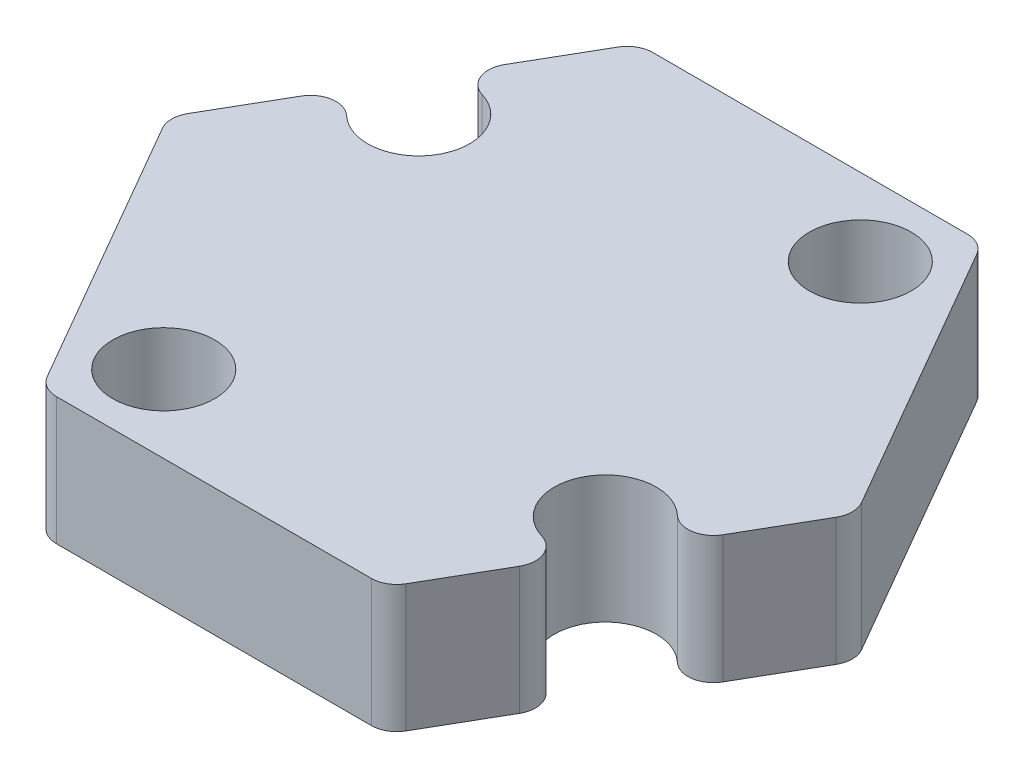
ISO-10303-21;
HEADER;
FILE_DESCRIPTION(('STEP AP214'),'2;1');
FILE_NAME('part.step','',(''),(''),'','','');
FILE_SCHEMA(('AUTOMOTIVE_DESIGN { 1 0 10303 214 1 1 1 1 }'));
ENDSEC;
DATA;
#1=APPLICATION_CONTEXT('core data for automotive mechanical design processes');
#2=APPLICATION_PROTOCOL_DEFINITION('international standard','automotive_design',2000,#1);
#3=PRODUCT_CONTEXT('',#1,'mechanical');
#4=PRODUCT('Part','Part','',(#3));
#5=PRODUCT_RELATED_PRODUCT_CATEGORY('part','',(#4));
#6=PRODUCT_DEFINITION_FORMATION('','',#4);
#7=PRODUCT_DEFINITION_CONTEXT('part definition',#1,'design');
#8=PRODUCT_DEFINITION('design','',#6,#7);
#9=PRODUCT_DEFINITION_SHAPE('','',#8);
#10=(LENGTH_UNIT() NAMED_UNIT(*) SI_UNIT(.MILLI.,.METRE.));
#11=(NAMED_UNIT(*) PLANE_ANGLE_UNIT() SI_UNIT($,.RADIAN.));
#12=(NAMED_UNIT(*) SI_UNIT($,.STERADIAN.) SOLID_ANGLE_UNIT());
#13=UNCERTAINTY_MEASURE_WITH_UNIT(LENGTH_MEASURE(1.E-05),#10,'distance_accuracy_value','');
#14=(GEOMETRIC_REPRESENTATION_CONTEXT(3) GLOBAL_UNCERTAINTY_ASSIGNED_CONTEXT((#13)) GLOBAL_UNIT_ASSIGNED_CONTEXT((#10,
#11,#12)) REPRESENTATION_CONTEXT('',''));
#15=CARTESIAN_POINT('',(0.,0.,0.));
#16=DIRECTION('',(0.,0.,1.));
#17=DIRECTION('',(1.,0.,0.));
#18=AXIS2_PLACEMENT_3D('',#15,#16,#17);
#19=CARTESIAN_POINT('',(6.75,5.,11.6913429510899));
#20=DIRECTION('',(-0.866025403784439,0.,-0.5));
#21=DIRECTION('',(-0.5,0.,0.866025403784439));
#22=AXIS2_PLACEMENT_3D('',#19,#20,#21);
#23=PLANE('',#22);
#24=DIRECTION('',(0.5,0.,-0.866025403784439));
#25=VECTOR('',#24,1.);
#26=CARTESIAN_POINT('',(6.75,0.,11.6913429510899));
#27=LINE('',#26,#25);
#28=CARTESIAN_POINT('',(7.03867513459481,0.,11.1913429510899));
#29=VERTEX_POINT('',#28);
#30=CARTESIAN_POINT('',(8.66537291372276,0.,8.37381974908086));
#31=VERTEX_POINT('',#30);
#32=EDGE_CURVE('E320',#29,#31,#27,.T.);
#33=ORIENTED_EDGE('',*,*,#32,.T.);
#34=DIRECTION('',(0.,1.,0.));
#35=VECTOR('',#34,1.);
#36=CARTESIAN_POINT('',(8.66537291372276,5.,8.37381974908086));
#37=LINE('',#36,#35);
#38=CARTESIAN_POINT('',(8.66537291372276,5.,8.37381974908086));
#39=VERTEX_POINT('',#38);
#40=EDGE_CURVE('E298',#31,#39,#37,.T.);
#41=ORIENTED_EDGE('',*,*,#40,.T.);
#42=DIRECTION('',(0.5,0.,-0.866025403784439));
#43=VECTOR('',#42,1.);
#44=CARTESIAN_POINT('',(6.75,5.,11.6913429510899));
#45=LINE('',#44,#43);
#46=CARTESIAN_POINT('',(7.03867513459481,5.,11.1913429510899));
#47=VERTEX_POINT('',#46);
#48=EDGE_CURVE('E340',#47,#39,#45,.T.);
#49=ORIENTED_EDGE('',*,*,#48,.F.);
#50=DIRECTION('',(0.,-1.,0.));
#51=VECTOR('',#50,1.);
#52=CARTESIAN_POINT('',(7.03867513459481,5.,11.1913429510899));
#53=LINE('',#52,#51);
#54=EDGE_CURVE('E249',#47,#29,#53,.T.);
#55=ORIENTED_EDGE('',*,*,#54,.T.);
#56=EDGE_LOOP('',(#33,#41,#49,#55));
#57=FACE_BOUND('',#56,.T.);
#58=ADVANCED_FACE('F36',(#57),#23,.F.);
#59=CARTESIAN_POINT('',(-6.75,5.,-11.6913429510899));
#60=DIRECTION('',(0.866025403784439,0.,0.5));
#61=DIRECTION('',(0.5,0.,-0.866025403784439));
#62=AXIS2_PLACEMENT_3D('',#59,#60,#61);
#63=PLANE('',#62);
#64=DIRECTION('',(-0.5,0.,0.866025403784439));
#65=VECTOR('',#64,1.);
#66=CARTESIAN_POINT('',(-6.75,0.,-11.6913429510899));
#67=LINE('',#66,#65);
#68=CARTESIAN_POINT('',(-7.03867513459481,0.,-11.1913429510899));
#69=VERTEX_POINT('',#68);
#70=CARTESIAN_POINT('',(-8.66537291372259,0.,-8.37381974908115));
#71=VERTEX_POINT('',#70);
#72=EDGE_CURVE('E192',#69,#71,#67,.T.);
#73=ORIENTED_EDGE('',*,*,#72,.T.);
#74=DIRECTION('',(0.,1.,0.));
#75=VECTOR('',#74,1.);
#76=CARTESIAN_POINT('',(-8.66537291372259,5.,-8.37381974908115));
#77=LINE('',#76,#75);
#78=CARTESIAN_POINT('',(-8.66537291372259,5.,-8.37381974908115));
#79=VERTEX_POINT('',#78);
#80=EDGE_CURVE('E44',#71,#79,#77,.T.);
#81=ORIENTED_EDGE('',*,*,#80,.T.);
#82=DIRECTION('',(-0.5,0.,0.866025403784439));
#83=VECTOR('',#82,1.);
#84=CARTESIAN_POINT('',(-6.75,5.,-11.6913429510899));
#85=LINE('',#84,#83);
#86=CARTESIAN_POINT('',(-7.03867513459481,5.,-11.1913429510899));
#87=VERTEX_POINT('',#86);
#88=EDGE_CURVE('E194',#87,#79,#85,.T.);
#89=ORIENTED_EDGE('',*,*,#88,.F.);
#90=DIRECTION('',(0.,-1.,0.));
#91=VECTOR('',#90,1.);
#92=CARTESIAN_POINT('',(-7.03867513459481,5.,-11.1913429510899));
#93=LINE('',#92,#91);
#94=EDGE_CURVE('E179',#87,#69,#93,.T.);
#95=ORIENTED_EDGE('',*,*,#94,.T.);
#96=EDGE_LOOP('',(#73,#81,#89,#95));
#97=FACE_BOUND('',#96,.T.);
#98=ADVANCED_FACE('F191',(#97),#63,.F.);
#99=CARTESIAN_POINT('',(11.5846270862776,5.,3.31752320200847));
#100=VERTEX_POINT('',#99);
#101=CARTESIAN_POINT('',(13.2113248654052,5.,0.499999999999997));
#102=VERTEX_POINT('',#101);
#103=EDGE_CURVE('E215',#100,#102,#45,.T.);
#104=ORIENTED_EDGE('',*,*,#103,.F.);
#105=DIRECTION('',(0.,1.,0.));
#106=VECTOR('',#105,1.);
#107=CARTESIAN_POINT('',(11.5846270862776,5.,3.31752320200847));
#108=LINE('',#107,#106);
#109=CARTESIAN_POINT('',(11.5846270862776,0.,3.31752320200847));
#110=VERTEX_POINT('',#109);
#111=EDGE_CURVE('E11',#100,#110,#108,.F.);
#112=ORIENTED_EDGE('',*,*,#111,.T.);
#113=CARTESIAN_POINT('',(13.2113248654052,0.,0.499999999999997));
#114=VERTEX_POINT('',#113);
#115=EDGE_CURVE('E276',#110,#114,#27,.T.);
#116=ORIENTED_EDGE('',*,*,#115,.T.);
#117=DIRECTION('',(0.,-1.,0.));
#118=VECTOR('',#117,1.);
#119=CARTESIAN_POINT('',(13.2113248654052,5.,0.499999999999999));
#120=LINE('',#119,#118);
#121=EDGE_CURVE('E252',#114,#102,#120,.F.);
#122=ORIENTED_EDGE('',*,*,#121,.T.);
#123=EDGE_LOOP('',(#104,#112,#116,#122));
#124=FACE_BOUND('',#123,.T.);
#125=ADVANCED_FACE('F409',(#124),#23,.F.);
#126=CARTESIAN_POINT('',(13.5,5.,0.));
#127=DIRECTION('',(-0.866025403784439,0.,0.5));
#128=DIRECTION('',(0.5,0.,0.866025403784439));
#129=AXIS2_PLACEMENT_3D('',#126,#127,#128);
#130=PLANE('',#129);
#131=DIRECTION('',(-0.5,0.,-0.866025403784439));
#132=VECTOR('',#131,1.);
#133=CARTESIAN_POINT('',(13.5,0.,0.));
#134=LINE('',#133,#132);
#135=CARTESIAN_POINT('',(13.2113248654052,0.,-0.500000000000002));
#136=VERTEX_POINT('',#135);
#137=CARTESIAN_POINT('',(7.03867513459481,0.,-11.1913429510899));
#138=VERTEX_POINT('',#137);
#139=EDGE_CURVE('E322',#136,#138,#134,.T.);
#140=ORIENTED_EDGE('',*,*,#139,.T.);
#141=DIRECTION('',(0.,-1.,0.));
#142=VECTOR('',#141,1.);
#143=CARTESIAN_POINT('',(7.03867513459481,5.,-11.1913429510899));
#144=LINE('',#143,#142);
#145=CARTESIAN_POINT('',(7.03867513459481,5.,-11.1913429510899));
#146=VERTEX_POINT('',#145);
#147=EDGE_CURVE('E247',#138,#146,#144,.F.);
#148=ORIENTED_EDGE('',*,*,#147,.T.);
#149=DIRECTION('',(-0.5,0.,-0.866025403784439));
#150=VECTOR('',#149,1.);
#151=CARTESIAN_POINT('',(13.5,5.,0.));
#152=LINE('',#151,#150);
#153=CARTESIAN_POINT('',(13.2113248654052,5.,-0.500000000000002));
#154=VERTEX_POINT('',#153);
#155=EDGE_CURVE('E337',#154,#146,#152,.T.);
#156=ORIENTED_EDGE('',*,*,#155,.F.);
#157=DIRECTION('',(0.,-1.,0.));
#158=VECTOR('',#157,1.);
#159=CARTESIAN_POINT('',(13.2113248654052,5.,-0.500000000000002));
#160=LINE('',#159,#158);
#161=EDGE_CURVE('E244',#154,#136,#160,.T.);
#162=ORIENTED_EDGE('',*,*,#161,.T.);
#163=EDGE_LOOP('',(#140,#148,#156,#162));
#164=FACE_BOUND('',#163,.T.);
#165=ADVANCED_FACE('F336',(#164),#130,.F.);
#166=CARTESIAN_POINT('',(6.75,5.,-11.6913429510899));
#167=DIRECTION('',(0.,0.,1.));
#168=DIRECTION('',(1.,0.,0.));
#169=AXIS2_PLACEMENT_3D('',#166,#167,#168);
#170=PLANE('',#169);
#171=DIRECTION('',(-1.,0.,0.));
#172=VECTOR('',#171,1.);
#173=CARTESIAN_POINT('',(6.75,0.,-11.6913429510899));
#174=LINE('',#173,#172);
#175=CARTESIAN_POINT('',(6.17264973081037,0.,-11.6913429510899));
#176=VERTEX_POINT('',#175);
#177=CARTESIAN_POINT('',(-6.17264973081037,0.,-11.6913429510899));
#178=VERTEX_POINT('',#177);
#179=EDGE_CURVE('E209',#176,#178,#174,.T.);
#180=ORIENTED_EDGE('',*,*,#179,.T.);
#181=DIRECTION('',(0.,-1.,0.));
#182=VECTOR('',#181,1.);
#183=CARTESIAN_POINT('',(-6.17264973081037,5.,-11.6913429510899));
#184=LINE('',#183,#182);
#185=CARTESIAN_POINT('',(-6.17264973081037,5.,-11.6913429510899));
#186=VERTEX_POINT('',#185);
#187=EDGE_CURVE('E180',#178,#186,#184,.F.);
#188=ORIENTED_EDGE('',*,*,#187,.T.);
#189=DIRECTION('',(-1.,0.,0.));
#190=VECTOR('',#189,1.);
#191=CARTESIAN_POINT('',(6.75,5.,-11.6913429510899));
#192=LINE('',#191,#190);
#193=CARTESIAN_POINT('',(6.17264973081037,5.,-11.6913429510899));
#194=VERTEX_POINT('',#193);
#195=EDGE_CURVE('E314',#194,#186,#192,.T.);
#196=ORIENTED_EDGE('',*,*,#195,.F.);
#197=DIRECTION('',(0.,-1.,0.));
#198=VECTOR('',#197,1.);
#199=CARTESIAN_POINT('',(6.17264973081037,5.,-11.6913429510899));
#200=LINE('',#199,#198);
#201=EDGE_CURVE('E185',#194,#176,#200,.T.);
#202=ORIENTED_EDGE('',*,*,#201,.T.);
#203=EDGE_LOOP('',(#180,#188,#196,#202));
#204=FACE_BOUND('',#203,.T.);
#205=ADVANCED_FACE('F328',(#204),#170,.F.);
#206=CARTESIAN_POINT('',(-11.5846270862777,5.,-3.31752320200818));
#207=VERTEX_POINT('',#206);
#208=CARTESIAN_POINT('',(-13.2113248654052,5.,-0.499999999999999));
#209=VERTEX_POINT('',#208);
#210=EDGE_CURVE('E310',#207,#209,#85,.T.);
#211=ORIENTED_EDGE('',*,*,#210,.F.);
#212=DIRECTION('',(0.,1.,0.));
#213=VECTOR('',#212,1.);
#214=CARTESIAN_POINT('',(-11.5846270862777,5.,-3.31752320200818));
#215=LINE('',#214,#213);
#216=CARTESIAN_POINT('',(-11.5846270862777,0.,-3.31752320200818));
#217=VERTEX_POINT('',#216);
#218=EDGE_CURVE('E278',#207,#217,#215,.F.);
#219=ORIENTED_EDGE('',*,*,#218,.T.);
#220=CARTESIAN_POINT('',(-13.2113248654052,0.,-0.499999999999999));
#221=VERTEX_POINT('',#220);
#222=EDGE_CURVE('E204',#217,#221,#67,.T.);
#223=ORIENTED_EDGE('',*,*,#222,.T.);
#224=DIRECTION('',(0.,-1.,0.));
#225=VECTOR('',#224,1.);
#226=CARTESIAN_POINT('',(-13.2113248654052,5.,-0.5));
#227=LINE('',#226,#225);
#228=EDGE_CURVE('E196',#221,#209,#227,.F.);
#229=ORIENTED_EDGE('',*,*,#228,.T.);
#230=EDGE_LOOP('',(#211,#219,#223,#229));
#231=FACE_BOUND('',#230,.T.);
#232=ADVANCED_FACE('F391',(#231),#63,.F.);
#233=CARTESIAN_POINT('',(-13.5,5.,0.));
#234=DIRECTION('',(0.866025403784439,0.,-0.5));
#235=DIRECTION('',(-0.5,0.,-0.866025403784439));
#236=AXIS2_PLACEMENT_3D('',#233,#234,#235);
#237=PLANE('',#236);
#238=DIRECTION('',(0.5,0.,0.866025403784439));
#239=VECTOR('',#238,1.);
#240=CARTESIAN_POINT('',(-13.5,0.,0.));
#241=LINE('',#240,#239);
#242=CARTESIAN_POINT('',(-13.2113248654052,0.,0.5));
#243=VERTEX_POINT('',#242);
#244=CARTESIAN_POINT('',(-7.03867513459482,0.,11.1913429510899));
#245=VERTEX_POINT('',#244);
#246=EDGE_CURVE('E203',#243,#245,#241,.T.);
#247=ORIENTED_EDGE('',*,*,#246,.T.);
#248=DIRECTION('',(0.,-1.,0.));
#249=VECTOR('',#248,1.);
#250=CARTESIAN_POINT('',(-7.03867513459482,5.,11.1913429510899));
#251=LINE('',#250,#249);
#252=CARTESIAN_POINT('',(-7.03867513459482,5.,11.1913429510899));
#253=VERTEX_POINT('',#252);
#254=EDGE_CURVE('E263',#245,#253,#251,.F.);
#255=ORIENTED_EDGE('',*,*,#254,.T.);
#256=DIRECTION('',(0.5,0.,0.866025403784439));
#257=VECTOR('',#256,1.);
#258=CARTESIAN_POINT('',(-13.5,5.,0.));
#259=LINE('',#258,#257);
#260=CARTESIAN_POINT('',(-13.2113248654052,5.,0.5));
#261=VERTEX_POINT('',#260);
#262=EDGE_CURVE('E309',#261,#253,#259,.T.);
#263=ORIENTED_EDGE('',*,*,#262,.F.);
#264=DIRECTION('',(0.,-1.,0.));
#265=VECTOR('',#264,1.);
#266=CARTESIAN_POINT('',(-13.2113248654052,5.,0.5));
#267=LINE('',#266,#265);
#268=EDGE_CURVE('E260',#261,#243,#267,.T.);
#269=ORIENTED_EDGE('',*,*,#268,.T.);
#270=EDGE_LOOP('',(#247,#255,#263,#269));
#271=FACE_BOUND('',#270,.T.);
#272=ADVANCED_FACE('F381',(#271),#237,.F.);
#273=CARTESIAN_POINT('',(-6.75,5.,11.6913429510899));
#274=DIRECTION('',(0.,0.,-1.));
#275=DIRECTION('',(-1.,0.,0.));
#276=AXIS2_PLACEMENT_3D('',#273,#274,#275);
#277=PLANE('',#276);
#278=DIRECTION('',(1.,0.,0.));
#279=VECTOR('',#278,1.);
#280=CARTESIAN_POINT('',(-6.75,0.,11.6913429510899));
#281=LINE('',#280,#279);
#282=CARTESIAN_POINT('',(-6.17264973081038,0.,11.6913429510899));
#283=VERTEX_POINT('',#282);
#284=CARTESIAN_POINT('',(6.17264973081037,0.,11.6913429510899));
#285=VERTEX_POINT('',#284);
#286=EDGE_CURVE('E207',#283,#285,#281,.T.);
#287=ORIENTED_EDGE('',*,*,#286,.T.);
#288=DIRECTION('',(0.,-1.,0.));
#289=VECTOR('',#288,1.);
#290=CARTESIAN_POINT('',(6.17264973081037,5.,11.6913429510899));
#291=LINE('',#290,#289);
#292=CARTESIAN_POINT('',(6.17264973081037,5.,11.6913429510899));
#293=VERTEX_POINT('',#292);
#294=EDGE_CURVE('E258',#285,#293,#291,.F.);
#295=ORIENTED_EDGE('',*,*,#294,.T.);
#296=DIRECTION('',(1.,0.,0.));
#297=VECTOR('',#296,1.);
#298=CARTESIAN_POINT('',(-6.75,5.,11.6913429510899));
#299=LINE('',#298,#297);
#300=CARTESIAN_POINT('',(-6.17264973081038,5.,11.6913429510899));
#301=VERTEX_POINT('',#300);
#302=EDGE_CURVE('E217',#301,#293,#299,.T.);
#303=ORIENTED_EDGE('',*,*,#302,.F.);
#304=DIRECTION('',(0.,-1.,0.));
#305=VECTOR('',#304,1.);
#306=CARTESIAN_POINT('',(-6.17264973081038,5.,11.6913429510899));
#307=LINE('',#306,#305);
#308=EDGE_CURVE('E255',#301,#283,#307,.T.);
#309=ORIENTED_EDGE('',*,*,#308,.T.);
#310=EDGE_LOOP('',(#287,#295,#303,#309));
#311=FACE_BOUND('',#310,.T.);
#312=ADVANCED_FACE('F372',(#311),#277,.F.);
#313=CARTESIAN_POINT('',(0.,5.,0.));
#314=DIRECTION('',(0.,1.,0.));
#315=DIRECTION('',(0.,0.,1.));
#316=AXIS2_PLACEMENT_3D('',#313,#314,#315);
#317=PLANE('',#316);
#318=CARTESIAN_POINT('',(-8.66025403784432,5.,-4.99999999999957));
#319=DIRECTION('',(0.,1.,0.));
#320=DIRECTION('',(0.,0.,1.));
#321=AXIS2_PLACEMENT_3D('',#318,#319,#320);
#322=CIRCLE('',#321,2.00000000000046);
#323=CARTESIAN_POINT('',(-10.0324858009438,5.,-3.5450154680052));
#324=VERTEX_POINT('',#323);
#325=CARTESIAN_POINT('',(-8.0863163525735,5.,-6.91587983272077));
#326=VERTEX_POINT('',#325);
#327=EDGE_CURVE('E347',#324,#326,#322,.T.);
#328=ORIENTED_EDGE('',*,*,#327,.F.);
#329=CARTESIAN_POINT('',(-10.7186016824933,5.,-2.81752320200818));
#330=DIRECTION('',(0.,1.,0.));
#331=DIRECTION('',(0.,0.,1.));
#332=AXIS2_PLACEMENT_3D('',#329,#330,#331);
#333=CIRCLE('',#332,1.);
#334=EDGE_CURVE('E296',#324,#207,#333,.T.);
#335=ORIENTED_EDGE('',*,*,#334,.T.);
#336=ORIENTED_EDGE('',*,*,#210,.T.);
#337=CARTESIAN_POINT('',(-12.3452994616207,5.,0.));
#338=DIRECTION('',(0.,1.,0.));
#339=DIRECTION('',(0.,0.,1.));
#340=AXIS2_PLACEMENT_3D('',#337,#338,#339);
#341=CIRCLE('',#340,1.);
#342=EDGE_CURVE('E232',#209,#261,#341,.T.);
#343=ORIENTED_EDGE('',*,*,#342,.T.);
#344=ORIENTED_EDGE('',*,*,#262,.T.);
#345=CARTESIAN_POINT('',(-6.17264973081038,5.,10.6913429510899));
#346=DIRECTION('',(0.,1.,0.));
#347=DIRECTION('',(0.,0.,1.));
#348=AXIS2_PLACEMENT_3D('',#345,#346,#347);
#349=CIRCLE('',#348,1.);
#350=EDGE_CURVE('E234',#253,#301,#349,.T.);
#351=ORIENTED_EDGE('',*,*,#350,.T.);
#352=ORIENTED_EDGE('',*,*,#302,.T.);
#353=CARTESIAN_POINT('',(6.17264973081037,5.,10.6913429510899));
#354=DIRECTION('',(0.,1.,0.));
#355=DIRECTION('',(0.,0.,1.));
#356=AXIS2_PLACEMENT_3D('',#353,#354,#355);
#357=CIRCLE('',#356,1.);
#358=EDGE_CURVE('E236',#293,#47,#357,.T.);
#359=ORIENTED_EDGE('',*,*,#358,.T.);
#360=ORIENTED_EDGE('',*,*,#48,.T.);
#361=CARTESIAN_POINT('',(7.79934750993832,5.,7.87381974908086));
#362=DIRECTION('',(0.,1.,0.));
#363=DIRECTION('',(0.,0.,1.));
#364=AXIS2_PLACEMENT_3D('',#361,#362,#363);
#365=CIRCLE('',#364,1.);
#366=CARTESIAN_POINT('',(8.08631635257381,5.,6.91587983272052));
#367=VERTEX_POINT('',#366);
#368=EDGE_CURVE('E294',#39,#367,#365,.T.);
#369=ORIENTED_EDGE('',*,*,#368,.T.);
#370=CARTESIAN_POINT('',(8.6602540378448,5.,4.99999999999984));
#371=DIRECTION('',(0.,1.,0.));
#372=DIRECTION('',(0.,0.,1.));
#373=AXIS2_PLACEMENT_3D('',#370,#371,#372);
#374=CIRCLE('',#373,2.00000000000001);
#375=CARTESIAN_POINT('',(10.0324858009437,5.,3.54501546800559));
#376=VERTEX_POINT('',#375);
#377=EDGE_CURVE('E346',#376,#367,#374,.T.);
#378=ORIENTED_EDGE('',*,*,#377,.F.);
#379=CARTESIAN_POINT('',(10.7186016824931,5.,2.81752320200847));
#380=DIRECTION('',(0.,1.,0.));
#381=DIRECTION('',(0.,0.,1.));
#382=AXIS2_PLACEMENT_3D('',#379,#380,#381);
#383=CIRCLE('',#382,1.);
#384=EDGE_CURVE('E59',#376,#100,#383,.T.);
#385=ORIENTED_EDGE('',*,*,#384,.T.);
#386=ORIENTED_EDGE('',*,*,#103,.T.);
#387=CARTESIAN_POINT('',(12.3452994616207,5.,0.));
#388=DIRECTION('',(0.,1.,0.));
#389=DIRECTION('',(0.,0.,1.));
#390=AXIS2_PLACEMENT_3D('',#387,#388,#389);
#391=CIRCLE('',#390,1.);
#392=EDGE_CURVE('E238',#102,#154,#391,.T.);
#393=ORIENTED_EDGE('',*,*,#392,.T.);
#394=ORIENTED_EDGE('',*,*,#155,.T.);
#395=CARTESIAN_POINT('',(6.17264973081037,5.,-10.6913429510899));
#396=DIRECTION('',(0.,1.,0.));
#397=DIRECTION('',(0.,0.,1.));
#398=AXIS2_PLACEMENT_3D('',#395,#396,#397);
#399=CIRCLE('',#398,1.);
#400=EDGE_CURVE('E240',#146,#194,#399,.T.);
#401=ORIENTED_EDGE('',*,*,#400,.T.);
#402=ORIENTED_EDGE('',*,*,#195,.T.);
#403=CARTESIAN_POINT('',(-6.17264973081037,5.,-10.6913429510899));
#404=DIRECTION('',(0.,1.,0.));
#405=DIRECTION('',(0.,0.,1.));
#406=AXIS2_PLACEMENT_3D('',#403,#404,#405);
#407=CIRCLE('',#406,1.);
#408=EDGE_CURVE('E242',#186,#87,#407,.T.);
#409=ORIENTED_EDGE('',*,*,#408,.T.);
#410=ORIENTED_EDGE('',*,*,#88,.T.);
#411=CARTESIAN_POINT('',(-7.79934750993815,5.,-7.87381974908115));
#412=DIRECTION('',(0.,1.,0.));
#413=DIRECTION('',(0.,0.,1.));
#414=AXIS2_PLACEMENT_3D('',#411,#412,#413);
#415=CIRCLE('',#414,1.);
#416=EDGE_CURVE('E51',#79,#326,#415,.T.);
#417=ORIENTED_EDGE('',*,*,#416,.T.);
#418=EDGE_LOOP('',(#328,#335,#336,#343,#344,#351,#352,#359,#360,#369,#378,#385,#386,#393,#394,
#401,#402,#409,#410,#417));
#419=FACE_BOUND('',#418,.T.);
#420=CARTESIAN_POINT('',(-4.99999999999946,5.,8.66025403784469));
#421=DIRECTION('',(0.,1.,0.));
#422=DIRECTION('',(0.,0.,1.));
#423=AXIS2_PLACEMENT_3D('',#420,#421,#422);
#424=CIRCLE('',#423,2.00000000000043);
#425=CARTESIAN_POINT('',(-4.99999999999946,5.,10.6602540378451));
#426=VERTEX_POINT('',#425);
#427=EDGE_CURVE('E349',#426,#426,#424,.T.);
#428=ORIENTED_EDGE('',*,*,#427,.F.);
#429=EDGE_LOOP('',(#428));
#430=FACE_BOUND('',#429,.T.);
#431=CARTESIAN_POINT('',(4.99999999999995,5.,-8.66025403784442));
#432=DIRECTION('',(0.,1.,0.));
#433=DIRECTION('',(0.,0.,1.));
#434=AXIS2_PLACEMENT_3D('',#431,#432,#433);
#435=CIRCLE('',#434,2.);
#436=CARTESIAN_POINT('',(4.99999999999995,5.,-6.66025403784442));
#437=VERTEX_POINT('',#436);
#438=EDGE_CURVE('E270',#437,#437,#435,.T.);
#439=ORIENTED_EDGE('',*,*,#438,.F.);
#440=EDGE_LOOP('',(#439));
#441=FACE_BOUND('',#440,.T.);
#442=ADVANCED_FACE('F305',(#419,#430,#441),#317,.T.);
#443=CARTESIAN_POINT('',(0.,0.,0.));
#444=DIRECTION('',(0.,1.,0.));
#445=DIRECTION('',(0.,0.,1.));
#446=AXIS2_PLACEMENT_3D('',#443,#444,#445);
#447=PLANE('',#446);
#448=CARTESIAN_POINT('',(-4.99999999999946,0.,8.66025403784469));
#449=DIRECTION('',(0.,1.,0.));
#450=DIRECTION('',(0.,0.,1.));
#451=AXIS2_PLACEMENT_3D('',#448,#449,#450);
#452=CIRCLE('',#451,2.00000000000043);
#453=CARTESIAN_POINT('',(-4.99999999999946,0.,10.6602540378451));
#454=VERTEX_POINT('',#453);
#455=EDGE_CURVE('E269',#454,#454,#452,.T.);
#456=ORIENTED_EDGE('',*,*,#455,.T.);
#457=EDGE_LOOP('',(#456));
#458=FACE_BOUND('',#457,.T.);
#459=CARTESIAN_POINT('',(4.99999999999995,0.,-8.66025403784442));
#460=DIRECTION('',(0.,1.,0.));
#461=DIRECTION('',(0.,0.,1.));
#462=AXIS2_PLACEMENT_3D('',#459,#460,#461);
#463=CIRCLE('',#462,2.);
#464=CARTESIAN_POINT('',(4.99999999999995,0.,-6.66025403784442));
#465=VERTEX_POINT('',#464);
#466=EDGE_CURVE('E266',#465,#465,#463,.T.);
#467=ORIENTED_EDGE('',*,*,#466,.T.);
#468=EDGE_LOOP('',(#467));
#469=FACE_BOUND('',#468,.T.);
#470=ORIENTED_EDGE('',*,*,#222,.F.);
#471=CARTESIAN_POINT('',(-10.7186016824933,0.,-2.81752320200818));
#472=DIRECTION('',(0.,1.,0.));
#473=DIRECTION('',(0.,0.,1.));
#474=AXIS2_PLACEMENT_3D('',#471,#472,#473);
#475=CIRCLE('',#474,1.);
#476=CARTESIAN_POINT('',(-10.0324858009438,0.,-3.5450154680052));
#477=VERTEX_POINT('',#476);
#478=EDGE_CURVE('E286',#217,#477,#475,.F.);
#479=ORIENTED_EDGE('',*,*,#478,.T.);
#480=CARTESIAN_POINT('',(-8.66025403784432,0.,-4.99999999999957));
#481=DIRECTION('',(0.,1.,0.));
#482=DIRECTION('',(0.,0.,1.));
#483=AXIS2_PLACEMENT_3D('',#480,#481,#482);
#484=CIRCLE('',#483,2.00000000000046);
#485=CARTESIAN_POINT('',(-8.0863163525735,0.,-6.91587983272077));
#486=VERTEX_POINT('',#485);
#487=EDGE_CURVE('E273',#477,#486,#484,.T.);
#488=ORIENTED_EDGE('',*,*,#487,.T.);
#489=CARTESIAN_POINT('',(-7.79934750993815,0.,-7.87381974908115));
#490=DIRECTION('',(0.,1.,0.));
#491=DIRECTION('',(0.,0.,1.));
#492=AXIS2_PLACEMENT_3D('',#489,#490,#491);
#493=CIRCLE('',#492,1.);
#494=EDGE_CURVE('E202',#486,#71,#493,.F.);
#495=ORIENTED_EDGE('',*,*,#494,.T.);
#496=ORIENTED_EDGE('',*,*,#72,.F.);
#497=CARTESIAN_POINT('',(-6.17264973081037,0.,-10.6913429510899));
#498=DIRECTION('',(0.,1.,0.));
#499=DIRECTION('',(0.,0.,1.));
#500=AXIS2_PLACEMENT_3D('',#497,#498,#499);
#501=CIRCLE('',#500,1.);
#502=EDGE_CURVE('E175',#69,#178,#501,.F.);
#503=ORIENTED_EDGE('',*,*,#502,.T.);
#504=ORIENTED_EDGE('',*,*,#179,.F.);
#505=CARTESIAN_POINT('',(6.17264973081037,0.,-10.6913429510899));
#506=DIRECTION('',(0.,1.,0.));
#507=DIRECTION('',(0.,0.,1.));
#508=AXIS2_PLACEMENT_3D('',#505,#506,#507);
#509=CIRCLE('',#508,1.);
#510=EDGE_CURVE('E186',#176,#138,#509,.F.);
#511=ORIENTED_EDGE('',*,*,#510,.T.);
#512=ORIENTED_EDGE('',*,*,#139,.F.);
#513=CARTESIAN_POINT('',(12.3452994616207,0.,0.));
#514=DIRECTION('',(0.,1.,0.));
#515=DIRECTION('',(0.,0.,1.));
#516=AXIS2_PLACEMENT_3D('',#513,#514,#515);
#517=CIRCLE('',#516,1.);
#518=EDGE_CURVE('E225',#136,#114,#517,.F.);
#519=ORIENTED_EDGE('',*,*,#518,.T.);
#520=ORIENTED_EDGE('',*,*,#115,.F.);
#521=CARTESIAN_POINT('',(10.7186016824931,0.,2.81752320200847));
#522=DIRECTION('',(0.,1.,0.));
#523=DIRECTION('',(0.,0.,1.));
#524=AXIS2_PLACEMENT_3D('',#521,#522,#523);
#525=CIRCLE('',#524,1.);
#526=CARTESIAN_POINT('',(10.0324858009437,0.,3.54501546800559));
#527=VERTEX_POINT('',#526);
#528=EDGE_CURVE('E281',#110,#527,#525,.F.);
#529=ORIENTED_EDGE('',*,*,#528,.T.);
#530=CARTESIAN_POINT('',(8.6602540378448,0.,4.99999999999984));
#531=DIRECTION('',(0.,1.,0.));
#532=DIRECTION('',(0.,0.,1.));
#533=AXIS2_PLACEMENT_3D('',#530,#531,#532);
#534=CIRCLE('',#533,2.00000000000001);
#535=CARTESIAN_POINT('',(8.08631635257381,0.,6.91587983272052));
#536=VERTEX_POINT('',#535);
#537=EDGE_CURVE('E265',#527,#536,#534,.T.);
#538=ORIENTED_EDGE('',*,*,#537,.T.);
#539=CARTESIAN_POINT('',(7.79934750993832,0.,7.87381974908086));
#540=DIRECTION('',(0.,1.,0.));
#541=DIRECTION('',(0.,0.,1.));
#542=AXIS2_PLACEMENT_3D('',#539,#540,#541);
#543=CIRCLE('',#542,1.);
#544=EDGE_CURVE('E284',#536,#31,#543,.F.);
#545=ORIENTED_EDGE('',*,*,#544,.T.);
#546=ORIENTED_EDGE('',*,*,#32,.F.);
#547=CARTESIAN_POINT('',(6.17264973081037,0.,10.6913429510899));
#548=DIRECTION('',(0.,1.,0.));
#549=DIRECTION('',(0.,0.,1.));
#550=AXIS2_PLACEMENT_3D('',#547,#548,#549);
#551=CIRCLE('',#550,1.);
#552=EDGE_CURVE('E223',#29,#285,#551,.F.);
#553=ORIENTED_EDGE('',*,*,#552,.T.);
#554=ORIENTED_EDGE('',*,*,#286,.F.);
#555=CARTESIAN_POINT('',(-6.17264973081038,0.,10.6913429510899));
#556=DIRECTION('',(0.,1.,0.));
#557=DIRECTION('',(0.,0.,1.));
#558=AXIS2_PLACEMENT_3D('',#555,#556,#557);
#559=CIRCLE('',#558,1.);
#560=EDGE_CURVE('E221',#283,#245,#559,.F.);
#561=ORIENTED_EDGE('',*,*,#560,.T.);
#562=ORIENTED_EDGE('',*,*,#246,.F.);
#563=CARTESIAN_POINT('',(-12.3452994616207,0.,0.));
#564=DIRECTION('',(0.,1.,0.));
#565=DIRECTION('',(0.,0.,1.));
#566=AXIS2_PLACEMENT_3D('',#563,#564,#565);
#567=CIRCLE('',#566,1.);
#568=EDGE_CURVE('E195',#243,#221,#567,.F.);
#569=ORIENTED_EDGE('',*,*,#568,.T.);
#570=EDGE_LOOP('',(#470,#479,#488,#495,#496,#503,#504,#511,#512,#519,#520,#529,#538,#545,#546,
#553,#554,#561,#562,#569));
#571=FACE_BOUND('',#570,.T.);
#572=ADVANCED_FACE('F199',(#458,#469,#571),#447,.F.);
#573=CARTESIAN_POINT('',(-6.17264973081037,5.,-10.6913429510899));
#574=DIRECTION('',(0.,-1.,0.));
#575=DIRECTION('',(0.,0.,-1.));
#576=AXIS2_PLACEMENT_3D('',#573,#574,#575);
#577=CYLINDRICAL_SURFACE('',#576,1.);
#578=ORIENTED_EDGE('',*,*,#408,.F.);
#579=ORIENTED_EDGE('',*,*,#187,.F.);
#580=ORIENTED_EDGE('',*,*,#502,.F.);
#581=ORIENTED_EDGE('',*,*,#94,.F.);
#582=EDGE_LOOP('',(#578,#579,#580,#581));
#583=FACE_BOUND('',#582,.T.);
#584=ADVANCED_FACE('F178',(#583),#577,.T.);
#585=CARTESIAN_POINT('',(6.17264973081037,5.,-10.6913429510899));
#586=DIRECTION('',(0.,-1.,0.));
#587=DIRECTION('',(0.,0.,-1.));
#588=AXIS2_PLACEMENT_3D('',#585,#586,#587);
#589=CYLINDRICAL_SURFACE('',#588,1.);
#590=ORIENTED_EDGE('',*,*,#400,.F.);
#591=ORIENTED_EDGE('',*,*,#147,.F.);
#592=ORIENTED_EDGE('',*,*,#510,.F.);
#593=ORIENTED_EDGE('',*,*,#201,.F.);
#594=EDGE_LOOP('',(#590,#591,#592,#593));
#595=FACE_BOUND('',#594,.T.);
#596=ADVANCED_FACE('F333',(#595),#589,.T.);
#597=CARTESIAN_POINT('',(12.3452994616207,5.,0.));
#598=DIRECTION('',(0.,-1.,0.));
#599=DIRECTION('',(0.,0.,-1.));
#600=AXIS2_PLACEMENT_3D('',#597,#598,#599);
#601=CYLINDRICAL_SURFACE('',#600,1.);
#602=ORIENTED_EDGE('',*,*,#392,.F.);
#603=ORIENTED_EDGE('',*,*,#121,.F.);
#604=ORIENTED_EDGE('',*,*,#518,.F.);
#605=ORIENTED_EDGE('',*,*,#161,.F.);
#606=EDGE_LOOP('',(#602,#603,#604,#605));
#607=FACE_BOUND('',#606,.T.);
#608=ADVANCED_FACE('F425',(#607),#601,.T.);
#609=CARTESIAN_POINT('',(6.17264973081037,5.,10.6913429510899));
#610=DIRECTION('',(0.,-1.,0.));
#611=DIRECTION('',(0.,0.,-1.));
#612=AXIS2_PLACEMENT_3D('',#609,#610,#611);
#613=CYLINDRICAL_SURFACE('',#612,1.);
#614=ORIENTED_EDGE('',*,*,#358,.F.);
#615=ORIENTED_EDGE('',*,*,#294,.F.);
#616=ORIENTED_EDGE('',*,*,#552,.F.);
#617=ORIENTED_EDGE('',*,*,#54,.F.);
#618=EDGE_LOOP('',(#614,#615,#616,#617));
#619=FACE_BOUND('',#618,.T.);
#620=ADVANCED_FACE('F368',(#619),#613,.T.);
#621=CARTESIAN_POINT('',(-6.17264973081038,5.,10.6913429510899));
#622=DIRECTION('',(0.,-1.,0.));
#623=DIRECTION('',(0.,0.,-1.));
#624=AXIS2_PLACEMENT_3D('',#621,#622,#623);
#625=CYLINDRICAL_SURFACE('',#624,1.);
#626=ORIENTED_EDGE('',*,*,#350,.F.);
#627=ORIENTED_EDGE('',*,*,#254,.F.);
#628=ORIENTED_EDGE('',*,*,#560,.F.);
#629=ORIENTED_EDGE('',*,*,#308,.F.);
#630=EDGE_LOOP('',(#626,#627,#628,#629));
#631=FACE_BOUND('',#630,.T.);
#632=ADVANCED_FACE('F377',(#631),#625,.T.);
#633=CARTESIAN_POINT('',(-12.3452994616207,5.,0.));
#634=DIRECTION('',(0.,-1.,0.));
#635=DIRECTION('',(0.,0.,-1.));
#636=AXIS2_PLACEMENT_3D('',#633,#634,#635);
#637=CYLINDRICAL_SURFACE('',#636,1.);
#638=ORIENTED_EDGE('',*,*,#342,.F.);
#639=ORIENTED_EDGE('',*,*,#228,.F.);
#640=ORIENTED_EDGE('',*,*,#568,.F.);
#641=ORIENTED_EDGE('',*,*,#268,.F.);
#642=EDGE_LOOP('',(#638,#639,#640,#641));
#643=FACE_BOUND('',#642,.T.);
#644=ADVANCED_FACE('F386',(#643),#637,.T.);
#645=CARTESIAN_POINT('',(4.99999999999995,-5.,-8.66025403784442));
#646=DIRECTION('',(0.,1.,0.));
#647=DIRECTION('',(0.,0.,1.));
#648=AXIS2_PLACEMENT_3D('',#645,#646,#647);
#649=CYLINDRICAL_SURFACE('',#648,2.);
#650=ORIENTED_EDGE('',*,*,#438,.T.);
#651=EDGE_LOOP('',(#650));
#652=FACE_BOUND('',#651,.T.);
#653=ORIENTED_EDGE('',*,*,#466,.F.);
#654=EDGE_LOOP('',(#653));
#655=FACE_BOUND('',#654,.T.);
#656=ADVANCED_FACE('F439',(#652,#655),#649,.F.);
#657=CARTESIAN_POINT('',(8.6602540378448,-5.,4.99999999999984));
#658=DIRECTION('',(0.,1.,0.));
#659=DIRECTION('',(0.,0.,1.));
#660=AXIS2_PLACEMENT_3D('',#657,#658,#659);
#661=CYLINDRICAL_SURFACE('',#660,2.00000000000001);
#662=ORIENTED_EDGE('',*,*,#377,.T.);
#663=DIRECTION('',(0.,1.,0.));
#664=VECTOR('',#663,1.);
#665=CARTESIAN_POINT('',(8.08631635257381,-5.,6.91587983272052));
#666=LINE('',#665,#664);
#667=EDGE_CURVE('E303',#367,#536,#666,.F.);
#668=ORIENTED_EDGE('',*,*,#667,.T.);
#669=ORIENTED_EDGE('',*,*,#537,.F.);
#670=DIRECTION('',(0.,1.,0.));
#671=VECTOR('',#670,1.);
#672=CARTESIAN_POINT('',(10.0324858009437,-5.,3.54501546800559));
#673=LINE('',#672,#671);
#674=EDGE_CURVE('E301',#527,#376,#673,.T.);
#675=ORIENTED_EDGE('',*,*,#674,.T.);
#676=EDGE_LOOP('',(#662,#668,#669,#675));
#677=FACE_BOUND('',#676,.T.);
#678=ADVANCED_FACE('F355',(#677),#661,.F.);
#679=CARTESIAN_POINT('',(-4.99999999999946,-5.,8.66025403784469));
#680=DIRECTION('',(0.,1.,0.));
#681=DIRECTION('',(0.,0.,1.));
#682=AXIS2_PLACEMENT_3D('',#679,#680,#681);
#683=CYLINDRICAL_SURFACE('',#682,2.00000000000043);
#684=ORIENTED_EDGE('',*,*,#427,.T.);
#685=EDGE_LOOP('',(#684));
#686=FACE_BOUND('',#685,.T.);
#687=ORIENTED_EDGE('',*,*,#455,.F.);
#688=EDGE_LOOP('',(#687));
#689=FACE_BOUND('',#688,.T.);
#690=ADVANCED_FACE('F444',(#686,#689),#683,.F.);
#691=CARTESIAN_POINT('',(-8.66025403784432,-5.,-4.99999999999957));
#692=DIRECTION('',(0.,1.,0.));
#693=DIRECTION('',(0.,0.,1.));
#694=AXIS2_PLACEMENT_3D('',#691,#692,#693);
#695=CYLINDRICAL_SURFACE('',#694,2.00000000000046);
#696=ORIENTED_EDGE('',*,*,#487,.F.);
#697=DIRECTION('',(0.,1.,0.));
#698=VECTOR('',#697,1.);
#699=CARTESIAN_POINT('',(-10.0324858009438,-5.,-3.5450154680052));
#700=LINE('',#699,#698);
#701=EDGE_CURVE('E290',#477,#324,#700,.T.);
#702=ORIENTED_EDGE('',*,*,#701,.T.);
#703=ORIENTED_EDGE('',*,*,#327,.T.);
#704=DIRECTION('',(0.,1.,0.));
#705=VECTOR('',#704,1.);
#706=CARTESIAN_POINT('',(-8.0863163525735,-5.,-6.91587983272077));
#707=LINE('',#706,#705);
#708=EDGE_CURVE('E288',#326,#486,#707,.F.);
#709=ORIENTED_EDGE('',*,*,#708,.T.);
#710=EDGE_LOOP('',(#696,#702,#703,#709));
#711=FACE_BOUND('',#710,.T.);
#712=ADVANCED_FACE('F398',(#711),#695,.F.);
#713=CARTESIAN_POINT('',(-10.7186016824933,-5.,-2.81752320200818));
#714=DIRECTION('',(0.,1.,0.));
#715=DIRECTION('',(0.,0.,1.));
#716=AXIS2_PLACEMENT_3D('',#713,#714,#715);
#717=CYLINDRICAL_SURFACE('',#716,1.);
#718=ORIENTED_EDGE('',*,*,#334,.F.);
#719=ORIENTED_EDGE('',*,*,#701,.F.);
#720=ORIENTED_EDGE('',*,*,#478,.F.);
#721=ORIENTED_EDGE('',*,*,#218,.F.);
#722=EDGE_LOOP('',(#718,#719,#720,#721));
#723=FACE_BOUND('',#722,.T.);
#724=ADVANCED_FACE('F395',(#723),#717,.T.);
#725=CARTESIAN_POINT('',(7.79934750993832,-5.,7.87381974908086));
#726=DIRECTION('',(0.,1.,0.));
#727=DIRECTION('',(0.,0.,1.));
#728=AXIS2_PLACEMENT_3D('',#725,#726,#727);
#729=CYLINDRICAL_SURFACE('',#728,1.);
#730=ORIENTED_EDGE('',*,*,#544,.F.);
#731=ORIENTED_EDGE('',*,*,#667,.F.);
#732=ORIENTED_EDGE('',*,*,#368,.F.);
#733=ORIENTED_EDGE('',*,*,#40,.F.);
#734=EDGE_LOOP('',(#730,#731,#732,#733));
#735=FACE_BOUND('',#734,.T.);
#736=ADVANCED_FACE('F360',(#735),#729,.T.);
#737=CARTESIAN_POINT('',(-7.79934750993815,-5.,-7.87381974908115));
#738=DIRECTION('',(0.,1.,0.));
#739=DIRECTION('',(0.,0.,1.));
#740=AXIS2_PLACEMENT_3D('',#737,#738,#739);
#741=CYLINDRICAL_SURFACE('',#740,1.);
#742=ORIENTED_EDGE('',*,*,#494,.F.);
#743=ORIENTED_EDGE('',*,*,#708,.F.);
#744=ORIENTED_EDGE('',*,*,#416,.F.);
#745=ORIENTED_EDGE('',*,*,#80,.F.);
#746=EDGE_LOOP('',(#742,#743,#744,#745));
#747=FACE_BOUND('',#746,.T.);
#748=ADVANCED_FACE('F399',(#747),#741,.T.);
#749=CARTESIAN_POINT('',(10.7186016824931,-5.,2.81752320200847));
#750=DIRECTION('',(0.,1.,0.));
#751=DIRECTION('',(0.,0.,1.));
#752=AXIS2_PLACEMENT_3D('',#749,#750,#751);
#753=CYLINDRICAL_SURFACE('',#752,1.);
#754=ORIENTED_EDGE('',*,*,#384,.F.);
#755=ORIENTED_EDGE('',*,*,#674,.F.);
#756=ORIENTED_EDGE('',*,*,#528,.F.);
#757=ORIENTED_EDGE('',*,*,#111,.F.);
#758=EDGE_LOOP('',(#754,#755,#756,#757));
#759=FACE_BOUND('',#758,.T.);
#760=ADVANCED_FACE('F38',(#759),#753,.T.);
#761=CLOSED_SHELL('',(#58,#98,#125,#165,#205,#232,#272,#312,#442,#572,#584,#596,#608,#620,#632,
#644,#656,#678,#690,#712,#724,#736,#748,#760));
#762=MANIFOLD_SOLID_BREP('B2',#761);
#763=ADVANCED_BREP_SHAPE_REPRESENTATION('',(#18,#762),#14);
#764=SHAPE_DEFINITION_REPRESENTATION(#9,#763);
ENDSEC;
END-ISO-10303-21;
